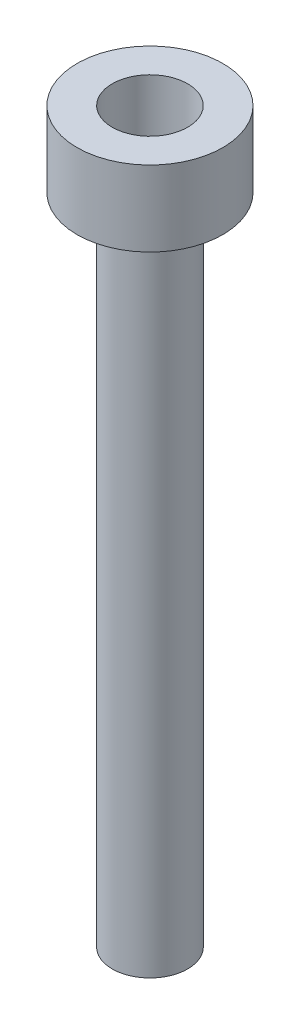
ISO-10303-21;
HEADER;
FILE_DESCRIPTION(('STEP AP214'),'2;1');
FILE_NAME('part.step','',(''),(''),'','','');
FILE_SCHEMA(('AUTOMOTIVE_DESIGN { 1 0 10303 214 1 1 1 1 }'));
ENDSEC;
DATA;
#1=APPLICATION_CONTEXT('core data for automotive mechanical design processes');
#2=APPLICATION_PROTOCOL_DEFINITION('international standard','automotive_design',2000,#1);
#3=PRODUCT_CONTEXT('',#1,'mechanical');
#4=PRODUCT('Part','Part','',(#3));
#5=PRODUCT_RELATED_PRODUCT_CATEGORY('part','',(#4));
#6=PRODUCT_DEFINITION_FORMATION('','',#4);
#7=PRODUCT_DEFINITION_CONTEXT('part definition',#1,'design');
#8=PRODUCT_DEFINITION('design','',#6,#7);
#9=PRODUCT_DEFINITION_SHAPE('','',#8);
#10=(LENGTH_UNIT() NAMED_UNIT(*) SI_UNIT(.MILLI.,.METRE.));
#11=(NAMED_UNIT(*) PLANE_ANGLE_UNIT() SI_UNIT($,.RADIAN.));
#12=(NAMED_UNIT(*) SI_UNIT($,.STERADIAN.) SOLID_ANGLE_UNIT());
#13=UNCERTAINTY_MEASURE_WITH_UNIT(LENGTH_MEASURE(1.E-05),#10,'distance_accuracy_value','');
#14=(GEOMETRIC_REPRESENTATION_CONTEXT(3) GLOBAL_UNCERTAINTY_ASSIGNED_CONTEXT((#13)) GLOBAL_UNIT_ASSIGNED_CONTEXT((#10,
#11,#12)) REPRESENTATION_CONTEXT('',''));
#15=CARTESIAN_POINT('',(0.,0.,0.));
#16=DIRECTION('',(0.,0.,1.));
#17=DIRECTION('',(1.,0.,0.));
#18=AXIS2_PLACEMENT_3D('',#15,#16,#17);
#19=CARTESIAN_POINT('',(0.,-26.,0.));
#20=DIRECTION('',(0.,1.,0.));
#21=DIRECTION('',(0.,0.,1.));
#22=AXIS2_PLACEMENT_3D('',#19,#20,#21);
#23=CYLINDRICAL_SURFACE('',#22,1.5);
#24=CARTESIAN_POINT('',(0.,-26.,0.));
#25=DIRECTION('',(0.,-1.,0.));
#26=DIRECTION('',(0.,0.,-1.));
#27=AXIS2_PLACEMENT_3D('',#24,#25,#26);
#28=CIRCLE('',#27,1.5);
#29=CARTESIAN_POINT('',(0.,-26.,1.5));
#30=VERTEX_POINT('',#29);
#31=EDGE_CURVE('E11',#30,#30,#28,.T.);
#32=CARTESIAN_POINT('',(0.,0.,0.));
#33=DIRECTION('',(0.,-1.,0.));
#34=DIRECTION('',(0.,0.,-1.));
#35=AXIS2_PLACEMENT_3D('',#32,#33,#34);
#36=CIRCLE('',#35,1.5);
#37=CARTESIAN_POINT('',(0.,0.,1.5));
#38=VERTEX_POINT('',#37);
#39=EDGE_CURVE('E45',#38,#38,#36,.T.);
#40=CARTESIAN_POINT('',(0.,-26.,1.5));
#41=CARTESIAN_POINT('',(0.,-25.7291666666667,1.5));
#42=CARTESIAN_POINT('',(0.,-25.4583333333333,1.5));
#43=CARTESIAN_POINT('',(0.,-24.9166666666667,1.5));
#44=CARTESIAN_POINT('',(0.,-24.6458333333333,1.5));
#45=CARTESIAN_POINT('',(0.,-24.1041666666667,1.5));
#46=CARTESIAN_POINT('',(0.,-23.8333333333333,1.5));
#47=CARTESIAN_POINT('',(0.,-23.2916666666667,1.5));
#48=CARTESIAN_POINT('',(0.,-23.0208333333333,1.5));
#49=CARTESIAN_POINT('',(0.,-22.4791666666667,1.5));
#50=CARTESIAN_POINT('',(0.,-22.2083333333333,1.5));
#51=CARTESIAN_POINT('',(0.,-21.6666666666667,1.5));
#52=CARTESIAN_POINT('',(0.,-21.3958333333333,1.5));
#53=CARTESIAN_POINT('',(0.,-20.8541666666667,1.5));
#54=CARTESIAN_POINT('',(0.,-20.5833333333333,1.5));
#55=CARTESIAN_POINT('',(0.,-20.0416666666667,1.5));
#56=CARTESIAN_POINT('',(0.,-19.7708333333333,1.5));
#57=CARTESIAN_POINT('',(0.,-19.2291666666667,1.5));
#58=CARTESIAN_POINT('',(0.,-18.9583333333333,1.5));
#59=CARTESIAN_POINT('',(0.,-18.4166666666667,1.5));
#60=CARTESIAN_POINT('',(0.,-18.1458333333333,1.5));
#61=CARTESIAN_POINT('',(0.,-17.6041666666667,1.5));
#62=CARTESIAN_POINT('',(0.,-17.3333333333333,1.5));
#63=CARTESIAN_POINT('',(0.,-16.7916666666667,1.5));
#64=CARTESIAN_POINT('',(0.,-16.5208333333333,1.5));
#65=CARTESIAN_POINT('',(0.,-15.9791666666667,1.5));
#66=CARTESIAN_POINT('',(0.,-15.7083333333333,1.5));
#67=CARTESIAN_POINT('',(0.,-15.1666666666667,1.5));
#68=CARTESIAN_POINT('',(0.,-14.8958333333333,1.5));
#69=CARTESIAN_POINT('',(0.,-14.3541666666667,1.5));
#70=CARTESIAN_POINT('',(0.,-14.0833333333333,1.5));
#71=CARTESIAN_POINT('',(0.,-13.5416666666667,1.5));
#72=CARTESIAN_POINT('',(0.,-13.2708333333333,1.5));
#73=CARTESIAN_POINT('',(0.,-12.7291666666667,1.5));
#74=CARTESIAN_POINT('',(0.,-12.4583333333333,1.5));
#75=CARTESIAN_POINT('',(0.,-11.9166666666667,1.5));
#76=CARTESIAN_POINT('',(0.,-11.6458333333333,1.5));
#77=CARTESIAN_POINT('',(0.,-11.1041666666667,1.5));
#78=CARTESIAN_POINT('',(0.,-10.8333333333333,1.5));
#79=CARTESIAN_POINT('',(0.,-10.2916666666667,1.5));
#80=CARTESIAN_POINT('',(0.,-10.0208333333333,1.5));
#81=CARTESIAN_POINT('',(0.,-9.47916666666667,1.5));
#82=CARTESIAN_POINT('',(0.,-9.20833333333333,1.5));
#83=CARTESIAN_POINT('',(0.,-8.66666666666667,1.5));
#84=CARTESIAN_POINT('',(0.,-8.39583333333333,1.5));
#85=CARTESIAN_POINT('',(0.,-7.85416666666667,1.5));
#86=CARTESIAN_POINT('',(0.,-7.58333333333333,1.5));
#87=CARTESIAN_POINT('',(0.,-7.04166666666667,1.5));
#88=CARTESIAN_POINT('',(0.,-6.77083333333333,1.5));
#89=CARTESIAN_POINT('',(0.,-6.22916666666667,1.5));
#90=CARTESIAN_POINT('',(0.,-5.95833333333333,1.5));
#91=CARTESIAN_POINT('',(0.,-5.41666666666667,1.5));
#92=CARTESIAN_POINT('',(0.,-5.14583333333333,1.5));
#93=CARTESIAN_POINT('',(0.,-4.60416666666667,1.5));
#94=CARTESIAN_POINT('',(0.,-4.33333333333333,1.5));
#95=CARTESIAN_POINT('',(0.,-3.79166666666667,1.5));
#96=CARTESIAN_POINT('',(0.,-3.52083333333333,1.5));
#97=CARTESIAN_POINT('',(0.,-2.97916666666667,1.5));
#98=CARTESIAN_POINT('',(0.,-2.70833333333333,1.5));
#99=CARTESIAN_POINT('',(0.,-2.16666666666667,1.5));
#100=CARTESIAN_POINT('',(0.,-1.89583333333333,1.5));
#101=CARTESIAN_POINT('',(0.,-1.35416666666667,1.5));
#102=CARTESIAN_POINT('',(0.,-1.08333333333333,1.5));
#103=CARTESIAN_POINT('',(0.,-0.541666666666667,1.5));
#104=CARTESIAN_POINT('',(0.,-0.270833333333334,1.5));
#105=CARTESIAN_POINT('',(0.,0.,1.5));
#106=B_SPLINE_CURVE_WITH_KNOTS('',3,(#40,#41,#42,#43,#44,#45,#46,#47,#48,#49,#50,#51,#52,#53,
#54,#55,#56,#57,#58,#59,#60,#61,#62,#63,#64,#65,#66,#67,#68,#69,#70,#71,#72,#73,#74,#75,#76,#77,
#78,#79,#80,#81,#82,#83,#84,#85,#86,#87,#88,#89,#90,#91,#92,#93,#94,#95,#96,#97,#98,#99,#100,
#101,#102,#103,#104,#105),.UNSPECIFIED.,.F.,.F.,(4,2,2,2,2,2,2,2,2,2,2,2,2,2,2,2,2,2,2,2,2,2,2,
2,2,2,2,2,2,2,2,2,4),(0.,0.812500000000001,1.625,2.4375,3.25,4.0625,4.875,5.6875,6.5,7.3125,
8.125,8.9375,9.75,10.5625,11.375,12.1875,13.,13.8125,14.625,15.4375,16.25,17.0625,17.875,
18.6875,19.5,20.3125,21.125,21.9375,22.75,23.5625,24.375,25.1875,26.),.UNSPECIFIED.);
#107=EDGE_CURVE('BSEAM42',#30,#38,#106,.T.);
#108=ORIENTED_EDGE('',*,*,#31,.F.);
#109=ORIENTED_EDGE('',*,*,#39,.T.);
#110=ORIENTED_EDGE('',*,*,#107,.T.);
#111=ORIENTED_EDGE('',*,*,#107,.F.);
#112=EDGE_LOOP('',(#108,#110,#109,#111));
#113=FACE_BOUND('',#112,.T.);
#114=ADVANCED_FACE('F42',(#113),#23,.T.);
#115=CARTESIAN_POINT('',(0.,-26.,0.));
#116=DIRECTION('',(0.,-1.,0.));
#117=DIRECTION('',(0.,0.,-1.));
#118=AXIS2_PLACEMENT_3D('',#115,#116,#117);
#119=PLANE('',#118);
#120=ORIENTED_EDGE('',*,*,#31,.T.);
#121=EDGE_LOOP('',(#120));
#122=FACE_BOUND('',#121,.T.);
#123=ADVANCED_FACE('F57',(#122),#119,.T.);
#124=CARTESIAN_POINT('',(0.,0.,0.));
#125=DIRECTION('',(0.,-1.,0.));
#126=DIRECTION('',(0.,0.,-1.));
#127=AXIS2_PLACEMENT_3D('',#124,#125,#126);
#128=PLANE('',#127);
#129=ORIENTED_EDGE('',*,*,#39,.F.);
#130=EDGE_LOOP('',(#129));
#131=FACE_BOUND('',#130,.T.);
#132=ADVANCED_FACE('F55',(#131),#128,.F.);
#133=CLOSED_SHELL('',(#114,#123,#132));
#134=MANIFOLD_SOLID_BREP('B2',#133);
#135=CARTESIAN_POINT('',(0.,3.,0.));
#136=DIRECTION('',(0.,-1.,0.));
#137=DIRECTION('',(0.,0.,-1.));
#138=AXIS2_PLACEMENT_3D('',#135,#136,#137);
#139=CYLINDRICAL_SURFACE('',#138,2.9);
#140=CARTESIAN_POINT('',(0.,3.,0.));
#141=DIRECTION('',(0.,1.,0.));
#142=DIRECTION('',(0.,0.,1.));
#143=AXIS2_PLACEMENT_3D('',#140,#141,#142);
#144=CIRCLE('',#143,2.9);
#145=CARTESIAN_POINT('',(0.,3.,2.9));
#146=VERTEX_POINT('',#145);
#147=EDGE_CURVE('E41',#146,#146,#144,.T.);
#148=ORIENTED_EDGE('',*,*,#147,.F.);
#149=EDGE_LOOP('',(#148));
#150=FACE_BOUND('',#149,.T.);
#151=CARTESIAN_POINT('',(0.,0.,0.));
#152=DIRECTION('',(0.,1.,0.));
#153=DIRECTION('',(0.,0.,1.));
#154=AXIS2_PLACEMENT_3D('',#151,#152,#153);
#155=CIRCLE('',#154,2.9);
#156=CARTESIAN_POINT('',(0.,0.,2.9));
#157=VERTEX_POINT('',#156);
#158=EDGE_CURVE('E85',#157,#157,#155,.T.);
#159=ORIENTED_EDGE('',*,*,#158,.T.);
#160=EDGE_LOOP('',(#159));
#161=FACE_BOUND('',#160,.T.);
#162=ADVANCED_FACE('F82',(#150,#161),#139,.T.);
#163=CARTESIAN_POINT('',(0.,3.,0.));
#164=DIRECTION('',(0.,1.,0.));
#165=DIRECTION('',(0.,0.,1.));
#166=AXIS2_PLACEMENT_3D('',#163,#164,#165);
#167=PLANE('',#166);
#168=CARTESIAN_POINT('',(0.,3.,0.));
#169=DIRECTION('',(0.,1.,0.));
#170=DIRECTION('',(0.,0.,1.));
#171=AXIS2_PLACEMENT_3D('',#168,#169,#170);
#172=CIRCLE('',#171,1.5);
#173=CARTESIAN_POINT('',(0.,3.,1.5));
#174=VERTEX_POINT('',#173);
#175=EDGE_CURVE('E94',#174,#174,#172,.T.);
#176=ORIENTED_EDGE('',*,*,#175,.F.);
#177=EDGE_LOOP('',(#176));
#178=FACE_BOUND('',#177,.T.);
#179=ORIENTED_EDGE('',*,*,#147,.T.);
#180=EDGE_LOOP('',(#179));
#181=FACE_BOUND('',#180,.T.);
#182=ADVANCED_FACE('F109',(#178,#181),#167,.T.);
#183=CARTESIAN_POINT('',(0.,0.,0.));
#184=DIRECTION('',(0.,1.,0.));
#185=DIRECTION('',(0.,0.,1.));
#186=AXIS2_PLACEMENT_3D('',#183,#184,#185);
#187=PLANE('',#186);
#188=CARTESIAN_POINT('',(0.,0.,0.));
#189=DIRECTION('',(0.,1.,0.));
#190=DIRECTION('',(0.,0.,1.));
#191=AXIS2_PLACEMENT_3D('',#188,#189,#190);
#192=CIRCLE('',#191,1.5);
#193=CARTESIAN_POINT('',(0.,0.,1.5));
#194=VERTEX_POINT('',#193);
#195=EDGE_CURVE('E92',#194,#194,#192,.T.);
#196=ORIENTED_EDGE('',*,*,#195,.T.);
#197=EDGE_LOOP('',(#196));
#198=FACE_BOUND('',#197,.T.);
#199=ORIENTED_EDGE('',*,*,#158,.F.);
#200=EDGE_LOOP('',(#199));
#201=FACE_BOUND('',#200,.T.);
#202=ADVANCED_FACE('F100',(#198,#201),#187,.F.);
#203=CARTESIAN_POINT('',(0.,0.,0.));
#204=DIRECTION('',(0.,1.,0.));
#205=DIRECTION('',(0.,0.,1.));
#206=AXIS2_PLACEMENT_3D('',#203,#204,#205);
#207=CYLINDRICAL_SURFACE('',#206,1.5);
#208=ORIENTED_EDGE('',*,*,#195,.F.);
#209=EDGE_LOOP('',(#208));
#210=FACE_BOUND('',#209,.T.);
#211=ORIENTED_EDGE('',*,*,#175,.T.);
#212=EDGE_LOOP('',(#211));
#213=FACE_BOUND('',#212,.T.);
#214=ADVANCED_FACE('F103',(#210,#213),#207,.F.);
#215=CLOSED_SHELL('',(#162,#182,#202,#214));
#216=MANIFOLD_SOLID_BREP('B6',#215);
#217=ADVANCED_BREP_SHAPE_REPRESENTATION('',(#18,#134,#216),#14);
#218=SHAPE_DEFINITION_REPRESENTATION(#9,#217);
ENDSEC;
END-ISO-10303-21;
